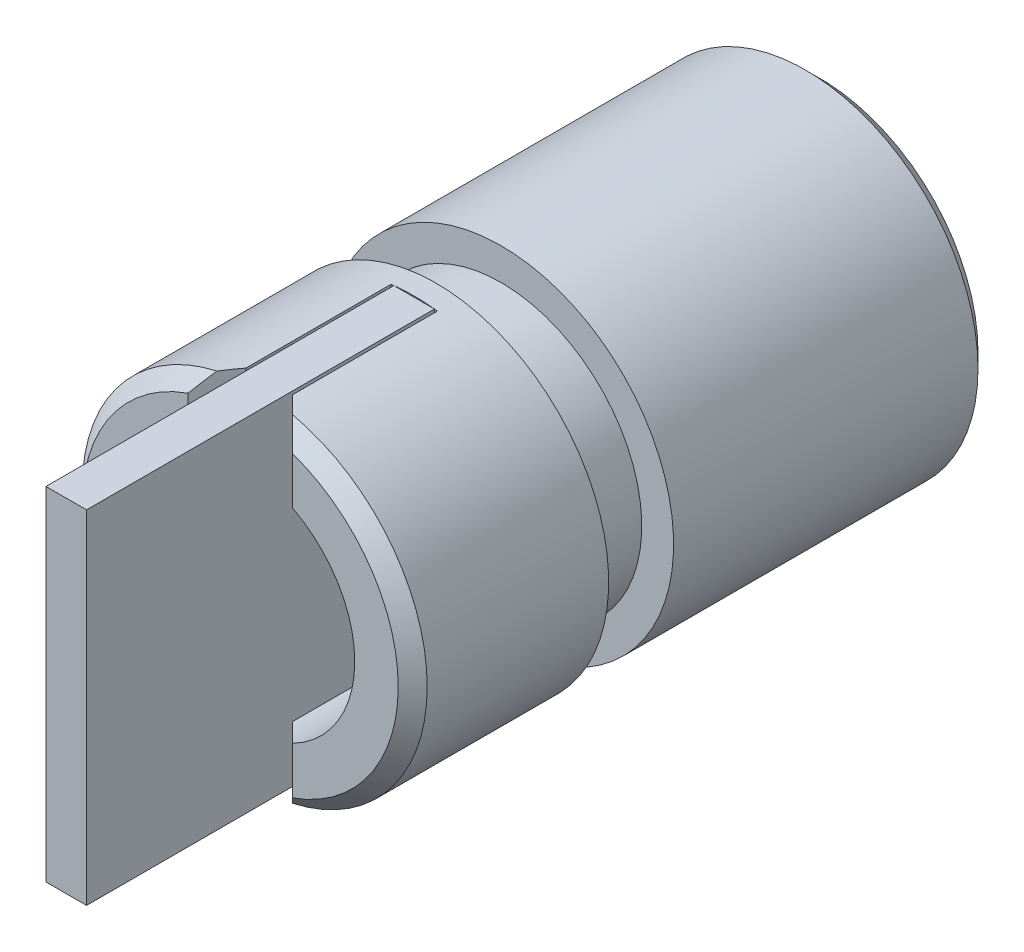
ISO-10303-21;
HEADER;
FILE_DESCRIPTION(('STEP AP214'),'2;1');
FILE_NAME('part.step','',(''),(''),'','','');
FILE_SCHEMA(('AUTOMOTIVE_DESIGN { 1 0 10303 214 1 1 1 1 }'));
ENDSEC;
DATA;
#1=APPLICATION_CONTEXT('core data for automotive mechanical design processes');
#2=APPLICATION_PROTOCOL_DEFINITION('international standard','automotive_design',2000,#1);
#3=PRODUCT_CONTEXT('',#1,'mechanical');
#4=PRODUCT('Part','Part','',(#3));
#5=PRODUCT_RELATED_PRODUCT_CATEGORY('part','',(#4));
#6=PRODUCT_DEFINITION_FORMATION('','',#4);
#7=PRODUCT_DEFINITION_CONTEXT('part definition',#1,'design');
#8=PRODUCT_DEFINITION('design','',#6,#7);
#9=PRODUCT_DEFINITION_SHAPE('','',#8);
#10=(LENGTH_UNIT() NAMED_UNIT(*) SI_UNIT(.MILLI.,.METRE.));
#11=(NAMED_UNIT(*) PLANE_ANGLE_UNIT() SI_UNIT($,.RADIAN.));
#12=(NAMED_UNIT(*) SI_UNIT($,.STERADIAN.) SOLID_ANGLE_UNIT());
#13=UNCERTAINTY_MEASURE_WITH_UNIT(LENGTH_MEASURE(1.E-05),#10,'distance_accuracy_value','');
#14=(GEOMETRIC_REPRESENTATION_CONTEXT(3) GLOBAL_UNCERTAINTY_ASSIGNED_CONTEXT((#13)) GLOBAL_UNIT_ASSIGNED_CONTEXT((#10,
#11,#12)) REPRESENTATION_CONTEXT('',''));
#15=CARTESIAN_POINT('',(0.,0.,0.));
#16=DIRECTION('',(0.,0.,1.));
#17=DIRECTION('',(1.,0.,0.));
#18=AXIS2_PLACEMENT_3D('',#15,#16,#17);
#19=CARTESIAN_POINT('',(0.,0.,7.));
#20=DIRECTION('',(0.,0.,-1.));
#21=DIRECTION('',(-1.,0.,0.));
#22=AXIS2_PLACEMENT_3D('',#19,#20,#21);
#23=PLANE('',#22);
#24=DIRECTION('',(0.,-1.,0.));
#25=VECTOR('',#24,1.);
#26=CARTESIAN_POINT('',(-0.35,2.95434002782347,7.));
#27=LINE('',#26,#25);
#28=CARTESIAN_POINT('',(-0.35,2.95434002782347,7.));
#29=VERTEX_POINT('',#28);
#30=CARTESIAN_POINT('',(-0.35,1.94373995174252,7.));
#31=VERTEX_POINT('',#30);
#32=EDGE_CURVE('E399',#29,#31,#27,.T.);
#33=ORIENTED_EDGE('',*,*,#32,.F.);
#34=CARTESIAN_POINT('',(0.,0.,7.));
#35=DIRECTION('',(0.,0.,-1.));
#36=DIRECTION('',(-1.,0.,0.));
#37=AXIS2_PLACEMENT_3D('',#34,#35,#36);
#38=CIRCLE('',#37,2.975);
#39=CARTESIAN_POINT('',(-0.4,2.94798660105503,7.));
#40=VERTEX_POINT('',#39);
#41=EDGE_CURVE('E249',#40,#29,#38,.T.);
#42=ORIENTED_EDGE('',*,*,#41,.F.);
#43=DIRECTION('',(0.,-1.,0.));
#44=VECTOR('',#43,1.);
#45=CARTESIAN_POINT('',(-0.4,3.34180450578738,7.));
#46=LINE('',#45,#44);
#47=CARTESIAN_POINT('',(-0.4,1.93406954373414,7.));
#48=VERTEX_POINT('',#47);
#49=EDGE_CURVE('E213',#40,#48,#46,.T.);
#50=ORIENTED_EDGE('',*,*,#49,.T.);
#51=CARTESIAN_POINT('',(0.,0.,7.));
#52=DIRECTION('',(0.,0.,-1.));
#53=DIRECTION('',(-1.,0.,0.));
#54=AXIS2_PLACEMENT_3D('',#51,#52,#53);
#55=CIRCLE('',#54,1.975);
#56=EDGE_CURVE('E69',#31,#48,#55,.F.);
#57=ORIENTED_EDGE('',*,*,#56,.F.);
#58=EDGE_LOOP('',(#33,#42,#50,#57));
#59=FACE_BOUND('',#58,.T.);
#60=ADVANCED_FACE('F45',(#59),#23,.F.);
#61=DIRECTION('',(0.,1.,0.));
#62=VECTOR('',#61,1.);
#63=CARTESIAN_POINT('',(0.35,2.95434002782347,7.));
#64=LINE('',#63,#62);
#65=CARTESIAN_POINT('',(0.35,1.94373995174252,7.));
#66=VERTEX_POINT('',#65);
#67=CARTESIAN_POINT('',(0.350000000000009,2.95434002782347,7.));
#68=VERTEX_POINT('',#67);
#69=EDGE_CURVE('E406',#66,#68,#64,.T.);
#70=ORIENTED_EDGE('',*,*,#69,.F.);
#71=CARTESIAN_POINT('',(0.4,1.93406954373414,7.));
#72=VERTEX_POINT('',#71);
#73=EDGE_CURVE('E289',#72,#66,#55,.F.);
#74=ORIENTED_EDGE('',*,*,#73,.F.);
#75=DIRECTION('',(0.,1.,0.));
#76=VECTOR('',#75,1.);
#77=CARTESIAN_POINT('',(0.4,3.34180450578738,7.));
#78=LINE('',#77,#76);
#79=CARTESIAN_POINT('',(0.4,2.94798660105503,7.));
#80=VERTEX_POINT('',#79);
#81=EDGE_CURVE('E219',#72,#80,#78,.T.);
#82=ORIENTED_EDGE('',*,*,#81,.T.);
#83=EDGE_CURVE('E247',#68,#80,#38,.T.);
#84=ORIENTED_EDGE('',*,*,#83,.F.);
#85=EDGE_LOOP('',(#70,#74,#82,#84));
#86=FACE_BOUND('',#85,.T.);
#87=ADVANCED_FACE('F420',(#86),#23,.F.);
#88=DIRECTION('',(-1.,0.,0.));
#89=VECTOR('',#88,1.);
#90=CARTESIAN_POINT('',(0.35,2.95434002782347,7.));
#91=LINE('',#90,#89);
#92=EDGE_CURVE('E61',#68,#29,#91,.T.);
#93=ORIENTED_EDGE('',*,*,#92,.F.);
#94=EDGE_CURVE('E907',#29,#68,#38,.T.);
#95=ORIENTED_EDGE('',*,*,#94,.F.);
#96=EDGE_LOOP('',(#93,#95));
#97=FACE_BOUND('',#96,.T.);
#98=ADVANCED_FACE('F466',(#97),#23,.F.);
#99=DIRECTION('',(0.,-1.,0.));
#100=VECTOR('',#99,1.);
#101=CARTESIAN_POINT('',(-0.35,0.,7.));
#102=LINE('',#101,#100);
#103=CARTESIAN_POINT('',(-0.35,-1.94373995174252,7.));
#104=VERTEX_POINT('',#103);
#105=CARTESIAN_POINT('',(-0.350000000000009,-2.95434002782347,7.));
#106=VERTEX_POINT('',#105);
#107=EDGE_CURVE('E11',#104,#106,#102,.T.);
#108=ORIENTED_EDGE('',*,*,#107,.F.);
#109=CARTESIAN_POINT('',(-0.4,-1.93406954373414,7.));
#110=VERTEX_POINT('',#109);
#111=EDGE_CURVE('E294',#110,#104,#55,.F.);
#112=ORIENTED_EDGE('',*,*,#111,.F.);
#113=CARTESIAN_POINT('',(-0.399999999999999,-2.94798660105503,7.));
#114=VERTEX_POINT('',#113);
#115=EDGE_CURVE('E210',#110,#114,#46,.T.);
#116=ORIENTED_EDGE('',*,*,#115,.T.);
#117=EDGE_CURVE('E243',#106,#114,#38,.T.);
#118=ORIENTED_EDGE('',*,*,#117,.F.);
#119=EDGE_LOOP('',(#108,#112,#116,#118));
#120=FACE_BOUND('',#119,.T.);
#121=ADVANCED_FACE('F480',(#120),#23,.F.);
#122=DIRECTION('',(1.,0.,0.));
#123=VECTOR('',#122,1.);
#124=CARTESIAN_POINT('',(0.35,-2.95434002782347,7.));
#125=LINE('',#124,#123);
#126=CARTESIAN_POINT('',(0.35,-2.95434002782347,7.));
#127=VERTEX_POINT('',#126);
#128=EDGE_CURVE('E401',#106,#127,#125,.T.);
#129=ORIENTED_EDGE('',*,*,#128,.F.);
#130=EDGE_CURVE('E248',#127,#106,#38,.T.);
#131=ORIENTED_EDGE('',*,*,#130,.F.);
#132=EDGE_LOOP('',(#129,#131));
#133=FACE_BOUND('',#132,.T.);
#134=ADVANCED_FACE('F471',(#133),#23,.F.);
#135=CARTESIAN_POINT('',(0.35,-1.94373995174252,7.));
#136=VERTEX_POINT('',#135);
#137=EDGE_CURVE('E407',#127,#136,#64,.T.);
#138=ORIENTED_EDGE('',*,*,#137,.F.);
#139=CARTESIAN_POINT('',(0.4,-2.94798660105503,7.));
#140=VERTEX_POINT('',#139);
#141=EDGE_CURVE('E244',#140,#127,#38,.T.);
#142=ORIENTED_EDGE('',*,*,#141,.F.);
#143=CARTESIAN_POINT('',(0.4,-1.93406954373414,7.));
#144=VERTEX_POINT('',#143);
#145=EDGE_CURVE('E222',#140,#144,#78,.T.);
#146=ORIENTED_EDGE('',*,*,#145,.T.);
#147=EDGE_CURVE('E292',#136,#144,#55,.F.);
#148=ORIENTED_EDGE('',*,*,#147,.F.);
#149=EDGE_LOOP('',(#138,#142,#146,#148));
#150=FACE_BOUND('',#149,.T.);
#151=ADVANCED_FACE('F462',(#150),#23,.F.);
#152=CARTESIAN_POINT('',(0.,0.,10.));
#153=DIRECTION('',(0.,0.,1.));
#154=DIRECTION('',(1.,0.,0.));
#155=AXIS2_PLACEMENT_3D('',#152,#153,#154);
#156=PLANE('',#155);
#157=CARTESIAN_POINT('',(0.,0.,10.));
#158=DIRECTION('',(0.,0.,1.));
#159=DIRECTION('',(1.,0.,0.));
#160=AXIS2_PLACEMENT_3D('',#157,#158,#159);
#161=CIRCLE('',#160,2.725);
#162=CARTESIAN_POINT('',(-0.899999999999999,2.57208572951992,10.));
#163=VERTEX_POINT('',#162);
#164=CARTESIAN_POINT('',(-0.899999999999998,-2.57208572951992,10.));
#165=VERTEX_POINT('',#164);
#166=EDGE_CURVE('E276',#163,#165,#161,.T.);
#167=ORIENTED_EDGE('',*,*,#166,.T.);
#168=DIRECTION('',(0.,1.,0.));
#169=VECTOR('',#168,1.);
#170=CARTESIAN_POINT('',(-0.899999999999998,-1.93406954373414,10.));
#171=LINE('',#170,#169);
#172=CARTESIAN_POINT('',(-0.899999999999998,-1.75801734917492,10.));
#173=VERTEX_POINT('',#172);
#174=EDGE_CURVE('E363',#165,#173,#171,.T.);
#175=ORIENTED_EDGE('',*,*,#174,.T.);
#176=CARTESIAN_POINT('',(0.,0.,10.));
#177=DIRECTION('',(0.,0.,1.));
#178=DIRECTION('',(1.,0.,0.));
#179=AXIS2_PLACEMENT_3D('',#176,#177,#178);
#180=CIRCLE('',#179,1.975);
#181=CARTESIAN_POINT('',(-0.899999999999999,1.75801734917492,10.));
#182=VERTEX_POINT('',#181);
#183=EDGE_CURVE('E256',#182,#173,#180,.T.);
#184=ORIENTED_EDGE('',*,*,#183,.F.);
#185=DIRECTION('',(0.,1.,0.));
#186=VECTOR('',#185,1.);
#187=CARTESIAN_POINT('',(-0.899999999999999,2.69548233160598,10.));
#188=LINE('',#187,#186);
#189=EDGE_CURVE('E355',#182,#163,#188,.T.);
#190=ORIENTED_EDGE('',*,*,#189,.T.);
#191=EDGE_LOOP('',(#167,#175,#184,#190));
#192=FACE_BOUND('',#191,.T.);
#193=ADVANCED_FACE('F470',(#192),#156,.T.);
#194=CARTESIAN_POINT('',(0.,0.,10.));
#195=DIRECTION('',(0.,0.,-1.));
#196=DIRECTION('',(-1.,0.,0.));
#197=AXIS2_PLACEMENT_3D('',#194,#195,#196);
#198=CONICAL_SURFACE('',#197,2.725,0.785398163397445);
#199=CARTESIAN_POINT('',(0.,0.,9.75));
#200=DIRECTION('',(0.,0.,1.));
#201=DIRECTION('',(1.,0.,0.));
#202=AXIS2_PLACEMENT_3D('',#199,#200,#201);
#203=CIRCLE('',#202,2.975);
#204=CARTESIAN_POINT('',(-0.650000000000001,-2.90312331808347,9.75));
#205=VERTEX_POINT('',#204);
#206=CARTESIAN_POINT('',(-0.650000000000002,2.90312331808347,9.75));
#207=VERTEX_POINT('',#206);
#208=EDGE_CURVE('E280',#205,#207,#203,.F.);
#209=ORIENTED_EDGE('',*,*,#208,.F.);
#210=CARTESIAN_POINT('',(-0.650000000000001,-2.90312331808347,9.75));
#211=CARTESIAN_POINT('',(-0.6713993920647,-2.87640248712604,9.7713993920647));
#212=CARTESIAN_POINT('',(-0.692669830231382,-2.84947449864875,9.79266983023139));
#213=CARTESIAN_POINT('',(-0.734930211622819,-2.79519549998653,9.83493021162282));
#214=CARTESIAN_POINT('',(-0.755920217519861,-2.76784458736935,9.85592021751986));
#215=CARTESIAN_POINT('',(-0.797607424555121,-2.7126981950487,9.89760742455512));
#216=CARTESIAN_POINT('',(-0.81830461822476,-2.68490270404405,9.91830461822476));
#217=CARTESIAN_POINT('',(-0.859390211605568,-2.62884596970216,9.95939021160557));
#218=CARTESIAN_POINT('',(-0.879778540017481,-2.60058462187701,9.97977854001748));
#219=CARTESIAN_POINT('',(-0.900000000000001,-2.57208572951993,10.));
#220=B_SPLINE_CURVE_WITH_KNOTS('',3,(#210,#211,#212,#213,#214,#215,#216,#217,#218,#219),
.UNSPECIFIED.,.F.,.F.,(4,2,2,2,4),(0.,0.121114612742696,0.242201689547167,0.363291849296118,
0.484409548464791),.UNSPECIFIED.);
#221=EDGE_CURVE('E348',#205,#165,#220,.T.);
#222=ORIENTED_EDGE('',*,*,#221,.T.);
#223=ORIENTED_EDGE('',*,*,#166,.F.);
#224=CARTESIAN_POINT('',(-0.899999999999999,2.57208572951992,10.));
#225=CARTESIAN_POINT('',(-0.879778540017479,2.60058462187701,9.97977854001748));
#226=CARTESIAN_POINT('',(-0.859390211605568,2.62884596970216,9.95939021160557));
#227=CARTESIAN_POINT('',(-0.818304618224763,2.68490270404405,9.91830461822476));
#228=CARTESIAN_POINT('',(-0.797607424555124,2.7126981950487,9.89760742455513));
#229=CARTESIAN_POINT('',(-0.755920217519862,2.76784458736934,9.85592021751986));
#230=CARTESIAN_POINT('',(-0.734930211622816,2.79519549998652,9.83493021162282));
#231=CARTESIAN_POINT('',(-0.692669830231393,2.84947449864876,9.79266983023139));
#232=CARTESIAN_POINT('',(-0.67139939206473,2.87640248712607,9.77139939206473));
#233=CARTESIAN_POINT('',(-0.650000000000075,2.90312331808358,9.75000000000008));
#234=B_SPLINE_CURVE_WITH_KNOTS('',3,(#224,#225,#226,#227,#228,#229,#230,#231,#232,#233),
.UNSPECIFIED.,.F.,.F.,(4,2,2,2,4),(0.,0.121117699168671,0.24220785891762,0.363294935722089,
0.484409548464783),.UNSPECIFIED.);
#235=EDGE_CURVE('E356',#163,#207,#234,.T.);
#236=ORIENTED_EDGE('',*,*,#235,.T.);
#237=EDGE_LOOP('',(#209,#222,#223,#236));
#238=FACE_BOUND('',#237,.T.);
#239=ADVANCED_FACE('F450',(#238),#198,.T.);
#240=CARTESIAN_POINT('',(0.,0.,10.));
#241=DIRECTION('',(0.,0.,-1.));
#242=DIRECTION('',(-1.,0.,0.));
#243=AXIS2_PLACEMENT_3D('',#240,#241,#242);
#244=CYLINDRICAL_SURFACE('',#243,2.975);
#245=CARTESIAN_POINT('',(0.650000000000004,2.90312331808347,9.75));
#246=VERTEX_POINT('',#245);
#247=CARTESIAN_POINT('',(0.650000000000003,-2.90312331808347,9.75));
#248=VERTEX_POINT('',#247);
#249=EDGE_CURVE('E279',#246,#248,#203,.F.);
#250=ORIENTED_EDGE('',*,*,#249,.T.);
#251=CARTESIAN_POINT('',(0.,0.,9.1));
#252=DIRECTION('',(-0.707106781186547,0.,0.707106781186547));
#253=DIRECTION('',(-0.707106781186548,0.,-0.707106781186548));
#254=AXIS2_PLACEMENT_3D('',#251,#252,#253);
#255=ELLIPSE('',#254,4.20728534805996,2.975);
#256=CARTESIAN_POINT('',(0.4,-2.94798660105503,9.5));
#257=VERTEX_POINT('',#256);
#258=EDGE_CURVE('E438',#248,#257,#255,.F.);
#259=ORIENTED_EDGE('',*,*,#258,.T.);
#260=DIRECTION('',(0.,0.,-1.));
#261=VECTOR('',#260,1.);
#262=CARTESIAN_POINT('',(0.4,-2.94798660105503,10.));
#263=LINE('',#262,#261);
#264=EDGE_CURVE('E226',#257,#140,#263,.T.);
#265=ORIENTED_EDGE('',*,*,#264,.T.);
#266=ORIENTED_EDGE('',*,*,#141,.T.);
#267=ORIENTED_EDGE('',*,*,#130,.T.);
#268=ORIENTED_EDGE('',*,*,#117,.T.);
#269=DIRECTION('',(0.,0.,-1.));
#270=VECTOR('',#269,1.);
#271=CARTESIAN_POINT('',(-0.4,-2.94798660105503,10.));
#272=LINE('',#271,#270);
#273=CARTESIAN_POINT('',(-0.4,-2.94798660105503,9.5));
#274=VERTEX_POINT('',#273);
#275=EDGE_CURVE('E233',#114,#274,#272,.F.);
#276=ORIENTED_EDGE('',*,*,#275,.T.);
#277=CARTESIAN_POINT('',(0.,0.,9.1));
#278=DIRECTION('',(0.707106781186546,0.,0.707106781186549));
#279=DIRECTION('',(0.707106781186549,0.,-0.707106781186546));
#280=AXIS2_PLACEMENT_3D('',#277,#278,#279);
#281=ELLIPSE('',#280,4.20728534805995,2.975);
#282=EDGE_CURVE('E435',#274,#205,#281,.F.);
#283=ORIENTED_EDGE('',*,*,#282,.T.);
#284=ORIENTED_EDGE('',*,*,#208,.T.);
#285=CARTESIAN_POINT('',(0.,0.,9.1));
#286=DIRECTION('',(0.707106781186546,0.,0.707106781186549));
#287=DIRECTION('',(0.707106781186549,0.,-0.707106781186546));
#288=AXIS2_PLACEMENT_3D('',#285,#286,#287);
#289=ELLIPSE('',#288,4.20728534805995,2.975);
#290=CARTESIAN_POINT('',(-0.4,2.94798660105503,9.5));
#291=VERTEX_POINT('',#290);
#292=EDGE_CURVE('E436',#207,#291,#289,.F.);
#293=ORIENTED_EDGE('',*,*,#292,.T.);
#294=DIRECTION('',(0.,0.,-1.));
#295=VECTOR('',#294,1.);
#296=CARTESIAN_POINT('',(-0.4,2.94798660105503,10.));
#297=LINE('',#296,#295);
#298=EDGE_CURVE('E236',#291,#40,#297,.T.);
#299=ORIENTED_EDGE('',*,*,#298,.T.);
#300=ORIENTED_EDGE('',*,*,#41,.T.);
#301=ORIENTED_EDGE('',*,*,#94,.T.);
#302=ORIENTED_EDGE('',*,*,#83,.T.);
#303=DIRECTION('',(0.,0.,-1.));
#304=VECTOR('',#303,1.);
#305=CARTESIAN_POINT('',(0.4,2.94798660105503,10.));
#306=LINE('',#305,#304);
#307=CARTESIAN_POINT('',(0.4,2.94798660105503,9.5));
#308=VERTEX_POINT('',#307);
#309=EDGE_CURVE('E223',#80,#308,#306,.F.);
#310=ORIENTED_EDGE('',*,*,#309,.T.);
#311=CARTESIAN_POINT('',(0.,0.,9.1));
#312=DIRECTION('',(-0.707106781186547,0.,0.707106781186547));
#313=DIRECTION('',(-0.707106781186548,0.,-0.707106781186548));
#314=AXIS2_PLACEMENT_3D('',#311,#312,#313);
#315=ELLIPSE('',#314,4.20728534805996,2.975);
#316=EDGE_CURVE('E431',#308,#246,#315,.F.);
#317=ORIENTED_EDGE('',*,*,#316,.T.);
#318=EDGE_LOOP('',(#250,#259,#265,#266,#267,#268,#276,#283,#284,#293,#299,#300,#301,#302,#310,#317));
#319=FACE_BOUND('',#318,.T.);
#320=CARTESIAN_POINT('',(0.,0.,6.62));
#321=DIRECTION('',(0.,0.,-1.));
#322=DIRECTION('',(-1.,0.,0.));
#323=AXIS2_PLACEMENT_3D('',#320,#321,#322);
#324=CIRCLE('',#323,2.975);
#325=CARTESIAN_POINT('',(-2.975,0.,6.62));
#326=VERTEX_POINT('',#325);
#327=EDGE_CURVE('E272',#326,#326,#324,.T.);
#328=ORIENTED_EDGE('',*,*,#327,.F.);
#329=EDGE_LOOP('',(#328));
#330=FACE_BOUND('',#329,.T.);
#331=ADVANCED_FACE('F453',(#319,#330),#244,.T.);
#332=CARTESIAN_POINT('',(0.900000000000001,-1.75801734917492,10.));
#333=VERTEX_POINT('',#332);
#334=CARTESIAN_POINT('',(0.9,1.75801734917492,10.));
#335=VERTEX_POINT('',#334);
#336=EDGE_CURVE('E253',#333,#335,#180,.T.);
#337=ORIENTED_EDGE('',*,*,#336,.F.);
#338=DIRECTION('',(0.,-1.,0.));
#339=VECTOR('',#338,1.);
#340=CARTESIAN_POINT('',(0.900000000000001,-2.69548233160598,10.));
#341=LINE('',#340,#339);
#342=CARTESIAN_POINT('',(0.900000000000001,-2.57208572951992,10.));
#343=VERTEX_POINT('',#342);
#344=EDGE_CURVE('E308',#333,#343,#341,.T.);
#345=ORIENTED_EDGE('',*,*,#344,.T.);
#346=CARTESIAN_POINT('',(0.9,2.57208572951992,10.));
#347=VERTEX_POINT('',#346);
#348=EDGE_CURVE('E275',#343,#347,#161,.T.);
#349=ORIENTED_EDGE('',*,*,#348,.T.);
#350=DIRECTION('',(0.,-1.,0.));
#351=VECTOR('',#350,1.);
#352=CARTESIAN_POINT('',(0.9,1.93406954373414,10.));
#353=LINE('',#352,#351);
#354=EDGE_CURVE('E306',#347,#335,#353,.T.);
#355=ORIENTED_EDGE('',*,*,#354,.T.);
#356=EDGE_LOOP('',(#337,#345,#349,#355));
#357=FACE_BOUND('',#356,.T.);
#358=ADVANCED_FACE('F479',(#357),#156,.T.);
#359=CARTESIAN_POINT('',(0.,0.,6.62));
#360=DIRECTION('',(0.,0.,-1.));
#361=DIRECTION('',(-1.,0.,0.));
#362=AXIS2_PLACEMENT_3D('',#359,#360,#361);
#363=PLANE('',#362);
#364=CARTESIAN_POINT('',(0.,0.,6.62));
#365=DIRECTION('',(0.,0.,-1.));
#366=DIRECTION('',(-1.,0.,0.));
#367=AXIS2_PLACEMENT_3D('',#364,#365,#366);
#368=CIRCLE('',#367,2.425);
#369=CARTESIAN_POINT('',(-2.425,0.,6.62));
#370=VERTEX_POINT('',#369);
#371=EDGE_CURVE('E264',#370,#370,#368,.T.);
#372=ORIENTED_EDGE('',*,*,#371,.F.);
#373=EDGE_LOOP('',(#372));
#374=FACE_BOUND('',#373,.T.);
#375=ORIENTED_EDGE('',*,*,#327,.T.);
#376=EDGE_LOOP('',(#375));
#377=FACE_BOUND('',#376,.T.);
#378=ADVANCED_FACE('F520',(#374,#377),#363,.T.);
#379=CARTESIAN_POINT('',(0.,0.,5.5));
#380=DIRECTION('',(0.,0.,-1.));
#381=DIRECTION('',(-1.,0.,0.));
#382=AXIS2_PLACEMENT_3D('',#379,#380,#381);
#383=PLANE('',#382);
#384=CARTESIAN_POINT('',(0.,0.,5.5));
#385=DIRECTION('',(0.,0.,-1.));
#386=DIRECTION('',(-1.,0.,0.));
#387=AXIS2_PLACEMENT_3D('',#384,#385,#386);
#388=CIRCLE('',#387,2.425);
#389=CARTESIAN_POINT('',(-2.425,0.,5.5));
#390=VERTEX_POINT('',#389);
#391=EDGE_CURVE('E263',#390,#390,#388,.T.);
#392=ORIENTED_EDGE('',*,*,#391,.T.);
#393=EDGE_LOOP('',(#392));
#394=FACE_BOUND('',#393,.T.);
#395=CARTESIAN_POINT('',(0.,0.,5.5));
#396=DIRECTION('',(0.,0.,-1.));
#397=DIRECTION('',(-1.,0.,0.));
#398=AXIS2_PLACEMENT_3D('',#395,#396,#397);
#399=CIRCLE('',#398,2.975);
#400=CARTESIAN_POINT('',(-2.975,0.,5.5));
#401=VERTEX_POINT('',#400);
#402=EDGE_CURVE('E267',#401,#401,#399,.T.);
#403=ORIENTED_EDGE('',*,*,#402,.F.);
#404=EDGE_LOOP('',(#403));
#405=FACE_BOUND('',#404,.T.);
#406=ADVANCED_FACE('F538',(#394,#405),#383,.F.);
#407=CARTESIAN_POINT('',(0.,0.,6.62));
#408=DIRECTION('',(0.,0.,-1.));
#409=DIRECTION('',(-1.,0.,0.));
#410=AXIS2_PLACEMENT_3D('',#407,#408,#409);
#411=CYLINDRICAL_SURFACE('',#410,2.425);
#412=ORIENTED_EDGE('',*,*,#371,.T.);
#413=EDGE_LOOP('',(#412));
#414=FACE_BOUND('',#413,.T.);
#415=ORIENTED_EDGE('',*,*,#391,.F.);
#416=EDGE_LOOP('',(#415));
#417=FACE_BOUND('',#416,.T.);
#418=ADVANCED_FACE('F532',(#414,#417),#411,.T.);
#419=CARTESIAN_POINT('',(0.,0.,0.));
#420=DIRECTION('',(0.,0.,1.));
#421=DIRECTION('',(1.,0.,0.));
#422=AXIS2_PLACEMENT_3D('',#419,#420,#421);
#423=PLANE('',#422);
#424=CARTESIAN_POINT('',(0.,0.,0.));
#425=DIRECTION('',(0.,0.,1.));
#426=DIRECTION('',(1.,0.,0.));
#427=AXIS2_PLACEMENT_3D('',#424,#425,#426);
#428=CIRCLE('',#427,2.725);
#429=CARTESIAN_POINT('',(2.725,0.,0.));
#430=VERTEX_POINT('',#429);
#431=EDGE_CURVE('E286',#430,#430,#428,.F.);
#432=ORIENTED_EDGE('',*,*,#431,.T.);
#433=EDGE_LOOP('',(#432));
#434=FACE_BOUND('',#433,.T.);
#435=CARTESIAN_POINT('',(0.,0.,0.));
#436=DIRECTION('',(0.,0.,-1.));
#437=DIRECTION('',(-1.,0.,0.));
#438=AXIS2_PLACEMENT_3D('',#435,#436,#437);
#439=CIRCLE('',#438,1.455);
#440=CARTESIAN_POINT('',(-1.455,0.,0.));
#441=VERTEX_POINT('',#440);
#442=EDGE_CURVE('E260',#441,#441,#439,.T.);
#443=ORIENTED_EDGE('',*,*,#442,.F.);
#444=EDGE_LOOP('',(#443));
#445=FACE_BOUND('',#444,.T.);
#446=ADVANCED_FACE('F524',(#434,#445),#423,.F.);
#447=CARTESIAN_POINT('',(0.,0.,0.25));
#448=DIRECTION('',(0.,0.,1.));
#449=DIRECTION('',(1.,0.,0.));
#450=AXIS2_PLACEMENT_3D('',#447,#448,#449);
#451=CIRCLE('',#450,2.975);
#452=CARTESIAN_POINT('',(2.975,0.,0.25));
#453=VERTEX_POINT('',#452);
#454=EDGE_CURVE('E283',#453,#453,#451,.T.);
#455=ORIENTED_EDGE('',*,*,#454,.T.);
#456=EDGE_LOOP('',(#455));
#457=FACE_BOUND('',#456,.T.);
#458=ORIENTED_EDGE('',*,*,#402,.T.);
#459=EDGE_LOOP('',(#458));
#460=FACE_BOUND('',#459,.T.);
#461=ADVANCED_FACE('F516',(#457,#460),#244,.T.);
#462=CARTESIAN_POINT('',(0.,0.,1.));
#463=DIRECTION('',(0.,0.,-1.));
#464=DIRECTION('',(-1.,0.,0.));
#465=AXIS2_PLACEMENT_3D('',#462,#463,#464);
#466=CYLINDRICAL_SURFACE('',#465,1.455);
#467=CARTESIAN_POINT('',(0.,0.,1.));
#468=DIRECTION('',(0.,0.,-1.));
#469=DIRECTION('',(-1.,0.,0.));
#470=AXIS2_PLACEMENT_3D('',#467,#468,#469);
#471=CIRCLE('',#470,1.455);
#472=CARTESIAN_POINT('',(-1.455,0.,1.));
#473=VERTEX_POINT('',#472);
#474=EDGE_CURVE('E257',#473,#473,#471,.T.);
#475=ORIENTED_EDGE('',*,*,#474,.F.);
#476=EDGE_LOOP('',(#475));
#477=FACE_BOUND('',#476,.T.);
#478=ORIENTED_EDGE('',*,*,#442,.T.);
#479=EDGE_LOOP('',(#478));
#480=FACE_BOUND('',#479,.T.);
#481=ADVANCED_FACE('F523',(#477,#480),#466,.F.);
#482=CARTESIAN_POINT('',(0.,0.,-4.58614357137373));
#483=DIRECTION('',(0.,0.,1.));
#484=DIRECTION('',(1.,0.,0.));
#485=AXIS2_PLACEMENT_3D('',#482,#483,#484);
#486=CYLINDRICAL_SURFACE('',#485,1.975);
#487=DIRECTION('',(0.,0.,1.));
#488=VECTOR('',#487,1.);
#489=CARTESIAN_POINT('',(0.4,-1.93406954373414,-4.58614357137373));
#490=LINE('',#489,#488);
#491=CARTESIAN_POINT('',(0.4,-1.93406954373414,9.5));
#492=VERTEX_POINT('',#491);
#493=EDGE_CURVE('E228',#144,#492,#490,.T.);
#494=ORIENTED_EDGE('',*,*,#493,.T.);
#495=CARTESIAN_POINT('',(0.,0.,9.1));
#496=DIRECTION('',(-0.707106781186547,0.,0.707106781186547));
#497=DIRECTION('',(0.707106781186548,0.,0.707106781186548));
#498=AXIS2_PLACEMENT_3D('',#495,#496,#497);
#499=ELLIPSE('',#498,2.79307178568686,1.975);
#500=EDGE_CURVE('E304',#492,#333,#499,.T.);
#501=ORIENTED_EDGE('',*,*,#500,.T.);
#502=ORIENTED_EDGE('',*,*,#336,.T.);
#503=CARTESIAN_POINT('',(0.,0.,9.1));
#504=DIRECTION('',(-0.707106781186547,0.,0.707106781186547));
#505=DIRECTION('',(0.707106781186548,0.,0.707106781186548));
#506=AXIS2_PLACEMENT_3D('',#503,#504,#505);
#507=ELLIPSE('',#506,2.79307178568686,1.975);
#508=CARTESIAN_POINT('',(0.4,1.93406954373414,9.5));
#509=VERTEX_POINT('',#508);
#510=EDGE_CURVE('E300',#335,#509,#507,.T.);
#511=ORIENTED_EDGE('',*,*,#510,.T.);
#512=DIRECTION('',(0.,0.,1.));
#513=VECTOR('',#512,1.);
#514=CARTESIAN_POINT('',(0.4,1.93406954373414,-4.58614357137373));
#515=LINE('',#514,#513);
#516=EDGE_CURVE('E231',#509,#72,#515,.F.);
#517=ORIENTED_EDGE('',*,*,#516,.T.);
#518=ORIENTED_EDGE('',*,*,#73,.T.);
#519=EDGE_CURVE('E293',#66,#31,#55,.F.);
#520=ORIENTED_EDGE('',*,*,#519,.T.);
#521=ORIENTED_EDGE('',*,*,#56,.T.);
#522=DIRECTION('',(0.,0.,1.));
#523=VECTOR('',#522,1.);
#524=CARTESIAN_POINT('',(-0.4,1.93406954373414,-4.58614357137373));
#525=LINE('',#524,#523);
#526=CARTESIAN_POINT('',(-0.4,1.93406954373414,9.5));
#527=VERTEX_POINT('',#526);
#528=EDGE_CURVE('E238',#48,#527,#525,.T.);
#529=ORIENTED_EDGE('',*,*,#528,.T.);
#530=CARTESIAN_POINT('',(0.,0.,9.1));
#531=DIRECTION('',(0.707106781186546,0.,0.707106781186549));
#532=DIRECTION('',(-0.707106781186549,0.,0.707106781186546));
#533=AXIS2_PLACEMENT_3D('',#530,#531,#532);
#534=ELLIPSE('',#533,2.79307178568686,1.975);
#535=EDGE_CURVE('E298',#527,#182,#534,.T.);
#536=ORIENTED_EDGE('',*,*,#535,.T.);
#537=ORIENTED_EDGE('',*,*,#183,.T.);
#538=CARTESIAN_POINT('',(0.,0.,9.1));
#539=DIRECTION('',(0.707106781186546,0.,0.707106781186549));
#540=DIRECTION('',(-0.707106781186549,0.,0.707106781186546));
#541=AXIS2_PLACEMENT_3D('',#538,#539,#540);
#542=ELLIPSE('',#541,2.79307178568686,1.975);
#543=CARTESIAN_POINT('',(-0.4,-1.93406954373414,9.5));
#544=VERTEX_POINT('',#543);
#545=EDGE_CURVE('E302',#173,#544,#542,.T.);
#546=ORIENTED_EDGE('',*,*,#545,.T.);
#547=DIRECTION('',(0.,0.,1.));
#548=VECTOR('',#547,1.);
#549=CARTESIAN_POINT('',(-0.4,-1.93406954373414,-4.58614357137373));
#550=LINE('',#549,#548);
#551=EDGE_CURVE('E241',#544,#110,#550,.F.);
#552=ORIENTED_EDGE('',*,*,#551,.T.);
#553=ORIENTED_EDGE('',*,*,#111,.T.);
#554=EDGE_CURVE('E383',#104,#136,#55,.F.);
#555=ORIENTED_EDGE('',*,*,#554,.T.);
#556=ORIENTED_EDGE('',*,*,#147,.T.);
#557=EDGE_LOOP('',(#494,#501,#502,#511,#517,#518,#520,#521,#529,#536,#537,#546,#552,#553,#555,#556));
#558=FACE_BOUND('',#557,.T.);
#559=CARTESIAN_POINT('',(0.,0.,1.5));
#560=DIRECTION('',(0.,0.,1.));
#561=DIRECTION('',(1.,0.,0.));
#562=AXIS2_PLACEMENT_3D('',#559,#560,#561);
#563=CIRCLE('',#562,1.975);
#564=CARTESIAN_POINT('',(1.975,0.,1.5));
#565=VERTEX_POINT('',#564);
#566=EDGE_CURVE('E250',#565,#565,#563,.T.);
#567=ORIENTED_EDGE('',*,*,#566,.F.);
#568=EDGE_LOOP('',(#567));
#569=FACE_BOUND('',#568,.T.);
#570=ADVANCED_FACE('F377',(#558,#569),#486,.F.);
#571=CARTESIAN_POINT('',(0.,0.,1.5));
#572=DIRECTION('',(0.,0.,1.));
#573=DIRECTION('',(1.,0.,0.));
#574=AXIS2_PLACEMENT_3D('',#571,#572,#573);
#575=PLANE('',#574);
#576=ORIENTED_EDGE('',*,*,#566,.T.);
#577=EDGE_LOOP('',(#576));
#578=FACE_BOUND('',#577,.T.);
#579=ADVANCED_FACE('F509',(#578),#575,.T.);
#580=CARTESIAN_POINT('',(0.,0.,1.));
#581=DIRECTION('',(0.,0.,1.));
#582=DIRECTION('',(1.,0.,0.));
#583=AXIS2_PLACEMENT_3D('',#580,#581,#582);
#584=PLANE('',#583);
#585=ORIENTED_EDGE('',*,*,#474,.T.);
#586=EDGE_LOOP('',(#585));
#587=FACE_BOUND('',#586,.T.);
#588=ADVANCED_FACE('F503',(#587),#584,.F.);
#589=ORIENTED_EDGE('',*,*,#348,.F.);
#590=CARTESIAN_POINT('',(0.900000000000001,-2.57208572951992,10.));
#591=CARTESIAN_POINT('',(0.879778540017481,-2.60058462187701,9.97977854001748));
#592=CARTESIAN_POINT('',(0.859390211605571,-2.62884596970216,9.95939021160557));
#593=CARTESIAN_POINT('',(0.818304618224765,-2.68490270404405,9.91830461822476));
#594=CARTESIAN_POINT('',(0.797607424555126,-2.7126981950487,9.89760742455513));
#595=CARTESIAN_POINT('',(0.755920217519864,-2.76784458736934,9.85592021751986));
#596=CARTESIAN_POINT('',(0.734930211622818,-2.79519549998652,9.83493021162282));
#597=CARTESIAN_POINT('',(0.692669830231396,-2.84947449864876,9.79266983023139));
#598=CARTESIAN_POINT('',(0.671399392064733,-2.87640248712607,9.77139939206473));
#599=CARTESIAN_POINT('',(0.650000000000078,-2.90312331808358,9.75000000000008));
#600=B_SPLINE_CURVE_WITH_KNOTS('',3,(#590,#591,#592,#593,#594,#595,#596,#597,#598,#599),
.UNSPECIFIED.,.F.,.F.,(4,2,2,2,4),(0.,0.121117699168671,0.24220785891762,0.363294935722089,
0.484409548464782),.UNSPECIFIED.);
#601=EDGE_CURVE('E317',#343,#248,#600,.T.);
#602=ORIENTED_EDGE('',*,*,#601,.T.);
#603=ORIENTED_EDGE('',*,*,#249,.F.);
#604=CARTESIAN_POINT('',(0.650000000000004,2.90312331808347,9.75));
#605=CARTESIAN_POINT('',(0.671399392064703,2.87640248712603,9.7713993920647));
#606=CARTESIAN_POINT('',(0.692669830231384,2.84947449864875,9.79266983023139));
#607=CARTESIAN_POINT('',(0.734930211622822,2.79519549998653,9.83493021162282));
#608=CARTESIAN_POINT('',(0.755920217519863,2.76784458736935,9.85592021751986));
#609=CARTESIAN_POINT('',(0.797607424555123,2.7126981950487,9.89760742455512));
#610=CARTESIAN_POINT('',(0.818304618224762,2.68490270404405,9.91830461822476));
#611=CARTESIAN_POINT('',(0.85939021160557,2.62884596970216,9.95939021160557));
#612=CARTESIAN_POINT('',(0.879778540017483,2.60058462187701,9.97977854001748));
#613=CARTESIAN_POINT('',(0.900000000000003,2.57208572951993,10.));
#614=B_SPLINE_CURVE_WITH_KNOTS('',3,(#604,#605,#606,#607,#608,#609,#610,#611,#612,#613),
.UNSPECIFIED.,.F.,.F.,(4,2,2,2,4),(0.,0.121114612742696,0.242201689547167,0.363291849296118,
0.48440954846479),.UNSPECIFIED.);
#615=EDGE_CURVE('E310',#246,#347,#614,.T.);
#616=ORIENTED_EDGE('',*,*,#615,.T.);
#617=EDGE_LOOP('',(#589,#602,#603,#616));
#618=FACE_BOUND('',#617,.T.);
#619=ADVANCED_FACE('F325',(#618),#198,.T.);
#620=CARTESIAN_POINT('',(0.,0.,0.25));
#621=DIRECTION('',(0.,0.,1.));
#622=DIRECTION('',(1.,0.,0.));
#623=AXIS2_PLACEMENT_3D('',#620,#621,#622);
#624=CONICAL_SURFACE('',#623,2.975,0.785398163397448);
#625=ORIENTED_EDGE('',*,*,#431,.F.);
#626=EDGE_LOOP('',(#625));
#627=FACE_BOUND('',#626,.T.);
#628=ORIENTED_EDGE('',*,*,#454,.F.);
#629=EDGE_LOOP('',(#628));
#630=FACE_BOUND('',#629,.T.);
#631=ADVANCED_FACE('F502',(#627,#630),#624,.T.);
#632=CARTESIAN_POINT('',(0.4,3.34180450578738,7.));
#633=DIRECTION('',(1.,0.,0.));
#634=DIRECTION('',(0.,1.,0.));
#635=AXIS2_PLACEMENT_3D('',#632,#633,#634);
#636=PLANE('',#635);
#637=ORIENTED_EDGE('',*,*,#516,.F.);
#638=DIRECTION('',(0.,1.,0.));
#639=VECTOR('',#638,1.);
#640=CARTESIAN_POINT('',(0.4,2.69548233160598,9.5));
#641=LINE('',#640,#639);
#642=EDGE_CURVE('E365',#509,#308,#641,.T.);
#643=ORIENTED_EDGE('',*,*,#642,.T.);
#644=ORIENTED_EDGE('',*,*,#309,.F.);
#645=ORIENTED_EDGE('',*,*,#81,.F.);
#646=EDGE_LOOP('',(#637,#643,#644,#645));
#647=FACE_BOUND('',#646,.T.);
#648=ADVANCED_FACE('F427',(#647),#636,.F.);
#649=CARTESIAN_POINT('',(-0.4,3.34180450578738,7.));
#650=DIRECTION('',(-1.,0.,0.));
#651=DIRECTION('',(0.,-1.,0.));
#652=AXIS2_PLACEMENT_3D('',#649,#650,#651);
#653=PLANE('',#652);
#654=ORIENTED_EDGE('',*,*,#298,.F.);
#655=DIRECTION('',(0.,-1.,0.));
#656=VECTOR('',#655,1.);
#657=CARTESIAN_POINT('',(-0.4,1.93406954373414,9.5));
#658=LINE('',#657,#656);
#659=EDGE_CURVE('E55',#291,#527,#658,.T.);
#660=ORIENTED_EDGE('',*,*,#659,.T.);
#661=ORIENTED_EDGE('',*,*,#528,.F.);
#662=ORIENTED_EDGE('',*,*,#49,.F.);
#663=EDGE_LOOP('',(#654,#660,#661,#662));
#664=FACE_BOUND('',#663,.T.);
#665=ADVANCED_FACE('F372',(#664),#653,.F.);
#666=ORIENTED_EDGE('',*,*,#551,.F.);
#667=DIRECTION('',(0.,-1.,0.));
#668=VECTOR('',#667,1.);
#669=CARTESIAN_POINT('',(-0.4,-2.69548233160598,9.5));
#670=LINE('',#669,#668);
#671=EDGE_CURVE('E441',#544,#274,#670,.T.);
#672=ORIENTED_EDGE('',*,*,#671,.T.);
#673=ORIENTED_EDGE('',*,*,#275,.F.);
#674=ORIENTED_EDGE('',*,*,#115,.F.);
#675=EDGE_LOOP('',(#666,#672,#673,#674));
#676=FACE_BOUND('',#675,.T.);
#677=ADVANCED_FACE('F556',(#676),#653,.F.);
#678=ORIENTED_EDGE('',*,*,#264,.F.);
#679=DIRECTION('',(0.,1.,0.));
#680=VECTOR('',#679,1.);
#681=CARTESIAN_POINT('',(0.4,-1.93406954373414,9.5));
#682=LINE('',#681,#680);
#683=EDGE_CURVE('E295',#257,#492,#682,.T.);
#684=ORIENTED_EDGE('',*,*,#683,.T.);
#685=ORIENTED_EDGE('',*,*,#493,.F.);
#686=ORIENTED_EDGE('',*,*,#145,.F.);
#687=EDGE_LOOP('',(#678,#684,#685,#686));
#688=FACE_BOUND('',#687,.T.);
#689=ADVANCED_FACE('F492',(#688),#636,.F.);
#690=CARTESIAN_POINT('',(0.4,3.34180450578738,9.5));
#691=DIRECTION('',(-0.707106781186547,0.,0.707106781186547));
#692=DIRECTION('',(0.,-1.,0.));
#693=AXIS2_PLACEMENT_3D('',#690,#691,#692);
#694=PLANE('',#693);
#695=ORIENTED_EDGE('',*,*,#601,.F.);
#696=ORIENTED_EDGE('',*,*,#344,.F.);
#697=ORIENTED_EDGE('',*,*,#500,.F.);
#698=ORIENTED_EDGE('',*,*,#683,.F.);
#699=ORIENTED_EDGE('',*,*,#258,.F.);
#700=EDGE_LOOP('',(#695,#696,#697,#698,#699));
#701=FACE_BOUND('',#700,.T.);
#702=ADVANCED_FACE('F344',(#701),#694,.T.);
#703=CARTESIAN_POINT('',(-0.4,3.34180450578738,9.5));
#704=DIRECTION('',(0.707106781186546,0.,0.707106781186549));
#705=DIRECTION('',(0.,1.,0.));
#706=AXIS2_PLACEMENT_3D('',#703,#704,#705);
#707=PLANE('',#706);
#708=ORIENTED_EDGE('',*,*,#545,.F.);
#709=ORIENTED_EDGE('',*,*,#174,.F.);
#710=ORIENTED_EDGE('',*,*,#221,.F.);
#711=ORIENTED_EDGE('',*,*,#282,.F.);
#712=ORIENTED_EDGE('',*,*,#671,.F.);
#713=EDGE_LOOP('',(#708,#709,#710,#711,#712));
#714=FACE_BOUND('',#713,.T.);
#715=ADVANCED_FACE('F337',(#714),#707,.T.);
#716=CARTESIAN_POINT('',(0.4,3.34180450578738,9.5));
#717=DIRECTION('',(-0.707106781186547,0.,0.707106781186547));
#718=DIRECTION('',(0.,-1.,0.));
#719=AXIS2_PLACEMENT_3D('',#716,#717,#718);
#720=PLANE('',#719);
#721=ORIENTED_EDGE('',*,*,#510,.F.);
#722=ORIENTED_EDGE('',*,*,#354,.F.);
#723=ORIENTED_EDGE('',*,*,#615,.F.);
#724=ORIENTED_EDGE('',*,*,#316,.F.);
#725=ORIENTED_EDGE('',*,*,#642,.F.);
#726=EDGE_LOOP('',(#721,#722,#723,#724,#725));
#727=FACE_BOUND('',#726,.T.);
#728=ADVANCED_FACE('F330',(#727),#720,.T.);
#729=CARTESIAN_POINT('',(-0.4,3.34180450578738,9.5));
#730=DIRECTION('',(0.707106781186546,0.,0.707106781186549));
#731=DIRECTION('',(0.,1.,0.));
#732=AXIS2_PLACEMENT_3D('',#729,#730,#731);
#733=PLANE('',#732);
#734=ORIENTED_EDGE('',*,*,#235,.F.);
#735=ORIENTED_EDGE('',*,*,#189,.F.);
#736=ORIENTED_EDGE('',*,*,#535,.F.);
#737=ORIENTED_EDGE('',*,*,#659,.F.);
#738=ORIENTED_EDGE('',*,*,#292,.F.);
#739=EDGE_LOOP('',(#734,#735,#736,#737,#738));
#740=FACE_BOUND('',#739,.T.);
#741=ADVANCED_FACE('F48',(#740),#733,.T.);
#742=CARTESIAN_POINT('',(0.,0.,7.));
#743=DIRECTION('',(0.,0.,-1.));
#744=DIRECTION('',(-1.,0.,0.));
#745=AXIS2_PLACEMENT_3D('',#742,#743,#744);
#746=PLANE('',#745);
#747=ORIENTED_EDGE('',*,*,#554,.F.);
#748=EDGE_CURVE('E395',#31,#104,#27,.T.);
#749=ORIENTED_EDGE('',*,*,#748,.F.);
#750=ORIENTED_EDGE('',*,*,#519,.F.);
#751=EDGE_CURVE('E397',#136,#66,#64,.T.);
#752=ORIENTED_EDGE('',*,*,#751,.F.);
#753=EDGE_LOOP('',(#747,#749,#750,#752));
#754=FACE_BOUND('',#753,.T.);
#755=ADVANCED_FACE('F394',(#754),#746,.T.);
#756=CARTESIAN_POINT('',(-0.35,2.95434002782347,13.));
#757=DIRECTION('',(1.,0.,0.));
#758=DIRECTION('',(0.,0.,-1.));
#759=AXIS2_PLACEMENT_3D('',#756,#757,#758);
#760=PLANE('',#759);
#761=ORIENTED_EDGE('',*,*,#32,.T.);
#762=ORIENTED_EDGE('',*,*,#748,.T.);
#763=ORIENTED_EDGE('',*,*,#107,.T.);
#764=DIRECTION('',(0.,0.,-1.));
#765=VECTOR('',#764,1.);
#766=CARTESIAN_POINT('',(-0.35,-2.95434002782347,13.));
#767=LINE('',#766,#765);
#768=CARTESIAN_POINT('',(-0.35,-2.95434002782347,13.));
#769=VERTEX_POINT('',#768);
#770=EDGE_CURVE('E191',#769,#106,#767,.T.);
#771=ORIENTED_EDGE('',*,*,#770,.F.);
#772=DIRECTION('',(0.,-1.,0.));
#773=VECTOR('',#772,1.);
#774=CARTESIAN_POINT('',(-0.35,2.95434002782347,13.));
#775=LINE('',#774,#773);
#776=CARTESIAN_POINT('',(-0.35,2.95434002782347,13.));
#777=VERTEX_POINT('',#776);
#778=EDGE_CURVE('E197',#777,#769,#775,.T.);
#779=ORIENTED_EDGE('',*,*,#778,.F.);
#780=DIRECTION('',(0.,0.,-1.));
#781=VECTOR('',#780,1.);
#782=CARTESIAN_POINT('',(-0.35,2.95434002782347,13.));
#783=LINE('',#782,#781);
#784=EDGE_CURVE('E410',#777,#29,#783,.T.);
#785=ORIENTED_EDGE('',*,*,#784,.T.);
#786=EDGE_LOOP('',(#761,#762,#763,#771,#779,#785));
#787=FACE_BOUND('',#786,.T.);
#788=ADVANCED_FACE('F208',(#787),#760,.F.);
#789=CARTESIAN_POINT('',(0.35,-2.95434002782347,13.));
#790=DIRECTION('',(0.,1.,0.));
#791=DIRECTION('',(0.,0.,1.));
#792=AXIS2_PLACEMENT_3D('',#789,#790,#791);
#793=PLANE('',#792);
#794=ORIENTED_EDGE('',*,*,#128,.T.);
#795=DIRECTION('',(0.,0.,-1.));
#796=VECTOR('',#795,1.);
#797=CARTESIAN_POINT('',(0.35,-2.95434002782347,13.));
#798=LINE('',#797,#796);
#799=CARTESIAN_POINT('',(0.35,-2.95434002782347,13.));
#800=VERTEX_POINT('',#799);
#801=EDGE_CURVE('E193',#800,#127,#798,.T.);
#802=ORIENTED_EDGE('',*,*,#801,.F.);
#803=DIRECTION('',(1.,0.,0.));
#804=VECTOR('',#803,1.);
#805=CARTESIAN_POINT('',(0.35,-2.95434002782347,13.));
#806=LINE('',#805,#804);
#807=EDGE_CURVE('E186',#769,#800,#806,.T.);
#808=ORIENTED_EDGE('',*,*,#807,.F.);
#809=ORIENTED_EDGE('',*,*,#770,.T.);
#810=EDGE_LOOP('',(#794,#802,#808,#809));
#811=FACE_BOUND('',#810,.T.);
#812=ADVANCED_FACE('F189',(#811),#793,.F.);
#813=CARTESIAN_POINT('',(0.35,2.95434002782347,13.));
#814=DIRECTION('',(-1.,0.,0.));
#815=DIRECTION('',(0.,0.,1.));
#816=AXIS2_PLACEMENT_3D('',#813,#814,#815);
#817=PLANE('',#816);
#818=ORIENTED_EDGE('',*,*,#137,.T.);
#819=ORIENTED_EDGE('',*,*,#751,.T.);
#820=ORIENTED_EDGE('',*,*,#69,.T.);
#821=DIRECTION('',(0.,0.,-1.));
#822=VECTOR('',#821,1.);
#823=CARTESIAN_POINT('',(0.35,2.95434002782347,13.));
#824=LINE('',#823,#822);
#825=CARTESIAN_POINT('',(0.35,2.95434002782347,13.));
#826=VERTEX_POINT('',#825);
#827=EDGE_CURVE('E215',#826,#68,#824,.T.);
#828=ORIENTED_EDGE('',*,*,#827,.F.);
#829=DIRECTION('',(0.,1.,0.));
#830=VECTOR('',#829,1.);
#831=CARTESIAN_POINT('',(0.35,2.95434002782347,13.));
#832=LINE('',#831,#830);
#833=EDGE_CURVE('E196',#800,#826,#832,.T.);
#834=ORIENTED_EDGE('',*,*,#833,.F.);
#835=ORIENTED_EDGE('',*,*,#801,.T.);
#836=EDGE_LOOP('',(#818,#819,#820,#828,#834,#835));
#837=FACE_BOUND('',#836,.T.);
#838=ADVANCED_FACE('F417',(#837),#817,.F.);
#839=CARTESIAN_POINT('',(0.35,2.95434002782347,13.));
#840=DIRECTION('',(0.,-1.,0.));
#841=DIRECTION('',(0.,0.,-1.));
#842=AXIS2_PLACEMENT_3D('',#839,#840,#841);
#843=PLANE('',#842);
#844=ORIENTED_EDGE('',*,*,#92,.T.);
#845=ORIENTED_EDGE('',*,*,#784,.F.);
#846=DIRECTION('',(-1.,0.,0.));
#847=VECTOR('',#846,1.);
#848=CARTESIAN_POINT('',(0.35,2.95434002782347,13.));
#849=LINE('',#848,#847);
#850=EDGE_CURVE('E202',#826,#777,#849,.T.);
#851=ORIENTED_EDGE('',*,*,#850,.F.);
#852=ORIENTED_EDGE('',*,*,#827,.T.);
#853=EDGE_LOOP('',(#844,#845,#851,#852));
#854=FACE_BOUND('',#853,.T.);
#855=ADVANCED_FACE('F414',(#854),#843,.F.);
#856=CARTESIAN_POINT('',(0.,0.,13.));
#857=DIRECTION('',(0.,0.,-1.));
#858=DIRECTION('',(-1.,0.,0.));
#859=AXIS2_PLACEMENT_3D('',#856,#857,#858);
#860=PLANE('',#859);
#861=ORIENTED_EDGE('',*,*,#778,.T.);
#862=ORIENTED_EDGE('',*,*,#807,.T.);
#863=ORIENTED_EDGE('',*,*,#833,.T.);
#864=ORIENTED_EDGE('',*,*,#850,.T.);
#865=EDGE_LOOP('',(#861,#862,#863,#864));
#866=FACE_BOUND('',#865,.T.);
#867=ADVANCED_FACE('F200',(#866),#860,.F.);
#868=CLOSED_SHELL('',(#60,#87,#98,#121,#134,#151,#193,#239,#331,#358,#378,#406,#418,#446,#461,
#481,#570,#579,#588,#619,#631,#648,#665,#677,#689,#702,#715,#728,#741,#755,#788,#812,#838,#855,#867));
#869=MANIFOLD_SOLID_BREP('B2',#868);
#870=ADVANCED_BREP_SHAPE_REPRESENTATION('',(#18,#869),#14);
#871=SHAPE_DEFINITION_REPRESENTATION(#9,#870);
ENDSEC;
END-ISO-10303-21;
